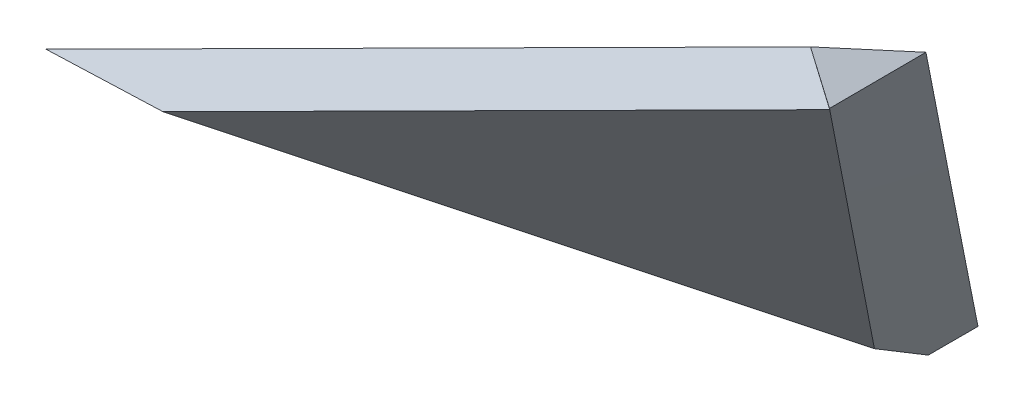
ISO-10303-21;
HEADER;
FILE_DESCRIPTION(('STEP AP214'),'2;1');
FILE_NAME('part.step','',(''),(''),'','','');
FILE_SCHEMA(('AUTOMOTIVE_DESIGN { 1 0 10303 214 1 1 1 1 }'));
ENDSEC;
DATA;
#1=APPLICATION_CONTEXT('core data for automotive mechanical design processes');
#2=APPLICATION_PROTOCOL_DEFINITION('international standard','automotive_design',2000,#1);
#3=PRODUCT_CONTEXT('',#1,'mechanical');
#4=PRODUCT('Part','Part','',(#3));
#5=PRODUCT_RELATED_PRODUCT_CATEGORY('part','',(#4));
#6=PRODUCT_DEFINITION_FORMATION('','',#4);
#7=PRODUCT_DEFINITION_CONTEXT('part definition',#1,'design');
#8=PRODUCT_DEFINITION('design','',#6,#7);
#9=PRODUCT_DEFINITION_SHAPE('','',#8);
#10=(LENGTH_UNIT() NAMED_UNIT(*) SI_UNIT(.MILLI.,.METRE.));
#11=(NAMED_UNIT(*) PLANE_ANGLE_UNIT() SI_UNIT($,.RADIAN.));
#12=(NAMED_UNIT(*) SI_UNIT($,.STERADIAN.) SOLID_ANGLE_UNIT());
#13=UNCERTAINTY_MEASURE_WITH_UNIT(LENGTH_MEASURE(1.E-05),#10,'distance_accuracy_value','');
#14=(GEOMETRIC_REPRESENTATION_CONTEXT(3) GLOBAL_UNCERTAINTY_ASSIGNED_CONTEXT((#13)) GLOBAL_UNIT_ASSIGNED_CONTEXT((#10,
#11,#12)) REPRESENTATION_CONTEXT('',''));
#15=CARTESIAN_POINT('',(0.,0.,0.));
#16=DIRECTION('',(0.,0.,1.));
#17=DIRECTION('',(1.,0.,0.));
#18=AXIS2_PLACEMENT_3D('',#15,#16,#17);
#19=CARTESIAN_POINT('',(255.683748074746,361.646186737307,597.997319736598));
#20=DIRECTION('',(0.,0.748896955513514,-0.662686464342369));
#21=DIRECTION('',(0.,0.662686464342369,0.748896955513514));
#22=AXIS2_PLACEMENT_3D('',#19,#20,#21);
#23=PLANE('',#22);
#24=CARTESIAN_POINT('',(85.6116867373077,31.4461867373069,224.84079999998));
#25=CARTESIAN_POINT('',(86.791715139685,30.5002030900796,223.771751043205));
#26=CARTESIAN_POINT('',(87.971851536975,29.5542786037553,222.702768943719));
#27=CARTESIAN_POINT('',(90.0071896012953,27.9231285745456,220.859418646722));
#28=CARTESIAN_POINT('',(90.8623399626348,27.2378749173705,220.085018677466));
#29=CARTESIAN_POINT('',(92.5727540636482,25.8674297312414,218.536288949587));
#30=CARTESIAN_POINT('',(93.4280178033234,25.1822382022881,217.761959190965));
#31=CARTESIAN_POINT('',(94.2833382255957,24.4970777475199,216.987664549043));
#32=B_SPLINE_CURVE_WITH_KNOTS('',3,(#24,#25,#26,#27,#28,#29,#30,#31),.UNSPECIFIED.,.F.,.F.,(4,2,
2,4),(0.,5.55625411428351,9.58179136847553,13.6073286710568),.UNSPECIFIED.);
#33=CARTESIAN_POINT('',(85.6116867373077,31.4461867373068,224.84079999998));
#34=VERTEX_POINT('',#33);
#35=CARTESIAN_POINT('',(94.2833382407781,24.49707773536,216.987664523408));
#36=VERTEX_POINT('',#35);
#37=EDGE_CURVE('E132',#34,#36,#32,.T.);
#38=ORIENTED_EDGE('',*,*,#37,.T.);
#39=CARTESIAN_POINT('',(133.673368018095,73.6208967689385,272.50212046123));
#40=CARTESIAN_POINT('',(130.389653372821,69.5276720617847,267.876398213436));
#41=CARTESIAN_POINT('',(127.106166331859,65.4343671616797,263.250585340196));
#42=CARTESIAN_POINT('',(120.539754300121,57.2475594550528,253.998735941171));
#43=CARTESIAN_POINT('',(117.256829309338,53.1540566485333,249.372699415391));
#44=CARTESIAN_POINT('',(110.691648134637,44.9668155027644,240.120360190074));
#45=CARTESIAN_POINT('',(107.40939195072,40.8730771635146,235.494057490538));
#46=CARTESIAN_POINT('',(100.845705935215,32.6853095099027,226.241123262694));
#47=CARTESIAN_POINT('',(97.564276103637,28.591280195537,221.614491734383));
#48=CARTESIAN_POINT('',(94.2833382594368,24.4970777204073,216.987664518403));
#49=B_SPLINE_CURVE_WITH_KNOTS('',3,(#39,#40,#41,#42,#43,#44,#45,#46,#47,#48),.UNSPECIFIED.,.F.,
.F.,(4,2,2,2,4),(0.,20.9859760452942,41.9719518319832,62.9579276438979,83.9439037144179),.UNSPECIFIED.);
#50=CARTESIAN_POINT('',(127.002104685391,65.3044903294402,263.103812515501));
#51=VERTEX_POINT('',#50);
#52=EDGE_CURVE('E122',#51,#36,#49,.T.);
#53=ORIENTED_EDGE('',*,*,#52,.F.);
#54=DIRECTION('',(0.323023809091136,0.627160398498758,0.708749217505835));
#55=VECTOR('',#54,1.);
#56=CARTESIAN_POINT('',(113.54960099329,39.1860515676662,233.587562638771));
#57=LINE('',#56,#55);
#58=CARTESIAN_POINT('',(275.298592529249,353.226562308607,588.482365922839));
#59=VERTEX_POINT('',#58);
#60=EDGE_CURVE('E197',#51,#59,#57,.T.);
#61=ORIENTED_EDGE('',*,*,#60,.T.);
#62=DIRECTION('',(-0.839309853134077,0.360271719670673,0.407140342434387));
#63=VECTOR('',#62,1.);
#64=CARTESIAN_POINT('',(355.038501124391,318.998399862187,549.801378716644));
#65=LINE('',#64,#63);
#66=CARTESIAN_POINT('',(255.683748074746,361.646186737307,597.997319736598));
#67=VERTEX_POINT('',#66);
#68=EDGE_CURVE('E195',#59,#67,#65,.T.);
#69=ORIENTED_EDGE('',*,*,#68,.T.);
#70=CARTESIAN_POINT('',(255.683748074746,361.646186737307,597.997319736598));
#71=CARTESIAN_POINT('',(198.993060962267,251.57952007064,473.611813157725));
#72=CARTESIAN_POINT('',(142.302373849787,141.512853403974,349.226306578853));
#73=CARTESIAN_POINT('',(85.6116867373077,31.4461867373069,224.84079999998));
#74=B_SPLINE_CURVE_WITH_KNOTS('',3,(#70,#71,#72,#73),.UNSPECIFIED.,.F.,.F.,(4,4),(0.,1.),.UNSPECIFIED.);
#75=EDGE_CURVE('E57',#34,#67,#74,.F.);
#76=ORIENTED_EDGE('',*,*,#75,.F.);
#77=EDGE_LOOP('',(#38,#53,#61,#69,#76));
#78=FACE_BOUND('',#77,.T.);
#79=ADVANCED_FACE('F41',(#78),#23,.F.);
#80=CARTESIAN_POINT('',(255.683748074746,361.646186737307,597.997319736598));
#81=DIRECTION('',(-0.463959634932353,0.757671489646803,-0.458993868074326));
#82=DIRECTION('',(0.852811638118461,0.522218641844302,0.));
#83=AXIS2_PLACEMENT_3D('',#80,#81,#82);
#84=PLANE('',#83);
#85=CARTESIAN_POINT('',(85.6116867373077,31.4461867373069,224.84079999998));
#86=CARTESIAN_POINT('',(87.0565588673166,30.2878880010275,221.468266328822));
#87=CARTESIAN_POINT('',(88.5018005266442,29.1298559686928,218.095799384672));
#88=CARTESIAN_POINT('',(90.6702176814584,27.3932082761787,213.037199178424));
#89=CARTESIAN_POINT('',(91.3931158628378,26.81439242296,211.351015767494));
#90=CARTESIAN_POINT('',(92.8390971677843,25.6568942252864,207.978682388508));
#91=CARTESIAN_POINT('',(93.5621802913542,25.0782118808334,206.292532420452));
#92=CARTESIAN_POINT('',(94.2853559086845,24.4995963224338,204.606399203203));
#93=B_SPLINE_CURVE_WITH_KNOTS('',3,(#85,#86,#87,#88,#89,#90,#91,#92),.UNSPECIFIED.,.F.,.F.,(4,2,
2,4),(0.,11.5425149767635,17.3137727652761,23.0850306366586),.UNSPECIFIED.);
#94=CARTESIAN_POINT('',(94.285355924013,24.4995963101699,204.606399133237));
#95=VERTEX_POINT('',#94);
#96=EDGE_CURVE('E128',#34,#95,#93,.T.);
#97=ORIENTED_EDGE('',*,*,#96,.F.);
#98=ORIENTED_EDGE('',*,*,#75,.T.);
#99=DIRECTION('',(-0.703292155228626,0.,0.710900938523698));
#100=VECTOR('',#99,1.);
#101=CARTESIAN_POINT('',(350.320400258716,361.646186737307,502.336811715639));
#102=LINE('',#101,#100);
#103=CARTESIAN_POINT('',(350.320400258716,361.646186737307,502.336811715639));
#104=VERTEX_POINT('',#103);
#105=EDGE_CURVE('E11',#104,#67,#102,.T.);
#106=ORIENTED_EDGE('',*,*,#105,.F.);
#107=CARTESIAN_POINT('',(358.920269811262,354.715030365189,482.202486292587));
#108=CARTESIAN_POINT('',(358.196405083762,355.298372315029,483.897118030486));
#109=CARTESIAN_POINT('',(357.47255102983,355.881721957202,485.591751679707));
#110=CARTESIAN_POINT('',(355.662942576478,357.340115293348,489.828340580871));
#111=CARTESIAN_POINT('',(354.577201518018,358.215168602499,492.370298221353));
#112=CARTESIAN_POINT('',(352.405767422695,359.965309834519,497.454222098826));
#113=CARTESIAN_POINT('',(351.320074385833,360.840397757388,499.996188335817));
#114=CARTESIAN_POINT('',(350.234405357301,361.715502986283,502.538158868865));
#115=B_SPLINE_CURVE_WITH_KNOTS('',3,(#107,#108,#109,#110,#111,#112,#113,#114),.UNSPECIFIED.,.F.,
.F.,(4,2,2,4),(0.,5.79865521575473,14.4966380429352,23.1946208738173),.UNSPECIFIED.);
#116=CARTESIAN_POINT('',(358.920269813023,354.715030361971,482.202486275138));
#117=VERTEX_POINT('',#116);
#118=EDGE_CURVE('E103',#117,#104,#115,.T.);
#119=ORIENTED_EDGE('',*,*,#118,.F.);
#120=CARTESIAN_POINT('',(358.92026981327,354.715030361774,482.202486275097));
#121=CARTESIAN_POINT('',(347.891392345303,340.956005258965,470.638351215407));
#122=CARTESIAN_POINT('',(336.862607918635,327.196982025532,459.074125193643));
#123=CARTESIAN_POINT('',(314.80530488357,299.678940859668,435.945413206486));
#124=CARTESIAN_POINT('',(303.776786275174,285.919922927235,424.380927241093));
#125=CARTESIAN_POINT('',(281.720094689012,258.401894021288,401.251617427607));
#126=CARTESIAN_POINT('',(270.691921711246,244.642883047773,389.686793579513));
#127=CARTESIAN_POINT('',(254.150019907439,224.004373818465,372.33920821136));
#128=CARTESIAN_POINT('',(248.636112258375,217.124871957668,366.556621498115));
#129=CARTESIAN_POINT('',(237.608439459981,203.365871104043,354.991308764435));
#130=CARTESIAN_POINT('',(232.094674310651,196.486372111216,349.208582744001));
#131=CARTESIAN_POINT('',(215.553631934114,175.847879682878,331.860156384337));
#132=CARTESIAN_POINT('',(204.526608234026,162.088891366017,320.294208224598));
#133=CARTESIAN_POINT('',(182.473555166235,134.570934893792,297.161340096279));
#134=CARTESIAN_POINT('',(171.447525798529,120.811966738428,285.594420127702));
#135=CARTESIAN_POINT('',(154.909671051817,100.173538546136,268.24287768774));
#136=CARTESIAN_POINT('',(149.397250970578,93.2940664266607,262.458836407628));
#137=CARTESIAN_POINT('',(138.37293270181,79.5351328318868,250.890243878003));
#138=CARTESIAN_POINT('',(132.861034514281,72.6556713565878,245.105692628492));
#139=CARTESIAN_POINT('',(121.837920364888,58.896762257468,233.535923387881));
#140=CARTESIAN_POINT('',(116.326704403032,52.0173146336474,227.750705396774));
#141=CARTESIAN_POINT('',(105.305236604595,38.2584391571064,216.179327495199));
#142=CARTESIAN_POINT('',(99.7949847680189,31.3790113043861,210.393167584724));
#143=CARTESIAN_POINT('',(94.2853559425244,24.4995962953363,204.606399124266));
#144=B_SPLINE_CURVE_WITH_KNOTS('',3,(#120,#121,#122,#123,#124,#125,#126,#127,#128,#129,#130,
#131,#132,#133,#134,#135,#136,#137,#138,#139,#140,#141,#142,#143),.UNSPECIFIED.,.F.,.F.,(4,2,2,
2,2,2,2,2,2,2,2,4),(0.,63.2620357498309,126.524071717887,189.78610768251,221.417125568464,
253.048143487038,316.310181938092,379.572220176311,411.203239867122,442.834259501264,
474.465279543079,506.096299780958),.UNSPECIFIED.);
#145=EDGE_CURVE('E198',#117,#95,#144,.T.);
#146=ORIENTED_EDGE('',*,*,#145,.T.);
#147=EDGE_LOOP('',(#97,#98,#106,#119,#146));
#148=FACE_BOUND('',#147,.T.);
#149=ADVANCED_FACE('F101',(#148),#84,.T.);
#150=CARTESIAN_POINT('',(85.6116867373077,31.4461867373069,230.451572510383));
#151=CARTESIAN_POINT('',(85.6116867373077,31.4461867373069,229.905322987356));
#152=CARTESIAN_POINT('',(85.6116867373077,31.4461867373069,229.359073464329));
#153=CARTESIAN_POINT('',(85.6116867373077,31.4461867373069,228.812823941302));
#154=CARTESIAN_POINT('',(85.6116867373077,31.4461867373069,227.488815960862));
#155=CARTESIAN_POINT('',(85.6116867373077,31.4461867373069,226.164807980421));
#156=CARTESIAN_POINT('',(85.6116867373077,31.4461867373069,224.84079999998));
#157=CARTESIAN_POINT('',(85.6116867373077,31.4461867373069,173.329599999988));
#158=CARTESIAN_POINT('',(85.6116867373077,31.4461867373069,121.818399999995));
#159=CARTESIAN_POINT('',(85.6116867373077,31.4461867373069,70.3072000000032));
#160=CARTESIAN_POINT('',(85.6116867373077,31.4461867373069,69.0582967896457));
#161=CARTESIAN_POINT('',(85.6116867373077,31.4461867373069,67.8093935792882));
#162=CARTESIAN_POINT('',(85.6116867373077,31.4461867373069,66.5604903689307));
#163=CARTESIAN_POINT('',(85.6116867373077,31.4461867373069,66.0196492570227));
#164=CARTESIAN_POINT('',(85.6116867373077,31.4461867373069,65.4788081451148));
#165=CARTESIAN_POINT('',(85.6116867373077,31.4461867373069,64.9379670332069));
#166=CARTESIAN_POINT('',(94.2811443606363,24.4943407304016,230.451572510383));
#167=CARTESIAN_POINT('',(94.2812333684707,24.4944517595647,229.905322987356));
#168=CARTESIAN_POINT('',(94.2813223763052,24.4945627887279,229.359073464329));
#169=CARTESIAN_POINT('',(94.2814113841396,24.494673817891,228.812823941302));
#170=CARTESIAN_POINT('',(94.2816271226953,24.4949429320812,227.488815960862));
#171=CARTESIAN_POINT('',(94.281842861251,24.4952120462714,226.164807980421));
#172=CARTESIAN_POINT('',(94.2820585998066,24.4954811604616,224.84079999998));
#173=CARTESIAN_POINT('',(94.2904520174086,24.5059511841163,173.329599999988));
#174=CARTESIAN_POINT('',(94.2988508466847,24.51646681801,121.818399999995));
#175=CARTESIAN_POINT('',(94.3072548008999,24.5270283852068,70.3072000000032));
#176=CARTESIAN_POINT('',(94.307458557081,24.527284453308,69.0582967896457));
#177=CARTESIAN_POINT('',(94.3076623132622,24.5275405214093,67.8093935792882));
#178=CARTESIAN_POINT('',(94.3078660694433,24.5277965895106,66.5604903689307));
#179=CARTESIAN_POINT('',(94.3079543066411,24.5279074805352,66.0196492570227));
#180=CARTESIAN_POINT('',(94.3080425438389,24.5280183715598,65.4788081451148));
#181=CARTESIAN_POINT('',(94.3081307810367,24.5281292625844,64.9379670332069));
#182=B_SPLINE_SURFACE_WITH_KNOTS('',1,3,((#150,#151,#152,#153,#154,#155,#156,#157,#158,#159,
#160,#161,#162,#163,#164,#165),(#166,#167,#168,#169,#170,#171,#172,#173,#174,#175,#176,#177,
#178,#179,#180,#181)),.UNSPECIFIED.,.F.,.F.,.F.,(2,2),(4,3,3,3,3,4),(0.,1.),
(-0.0363077836173099,-0.0257033029795639,0.,1.,1.0242452750151,1.03474476079504),.UNSPECIFIED.);
#183=CARTESIAN_POINT('',(94.2853559055034,24.4995963250058,204.60639913066));
#184=CARTESIAN_POINT('',(94.2852718310441,24.4994913477687,205.122285188622));
#185=CARTESIAN_POINT('',(94.2851877571238,24.4993863751105,205.638171246586));
#186=CARTESIAN_POINT('',(94.2850196103618,24.4991764389516,206.669943362514));
#187=CARTESIAN_POINT('',(94.2849355375201,24.4990714754508,207.185829420478));
#188=CARTESIAN_POINT('',(94.284767392916,24.4988615576058,208.217601536406));
#189=CARTESIAN_POINT('',(94.2846833211535,24.4987566032617,208.73348759437));
#190=CARTESIAN_POINT('',(94.2845151787083,24.4985467037294,209.765259710297));
#191=CARTESIAN_POINT('',(94.2844311080257,24.4984417585413,210.281145768261));
#192=CARTESIAN_POINT('',(94.2842629677407,24.4982318773205,211.312917884189));
#193=CARTESIAN_POINT('',(94.2841788981384,24.4981269412877,211.828803942153));
#194=CARTESIAN_POINT('',(94.2840107600147,24.497917078377,212.86057605808));
#195=CARTESIAN_POINT('',(94.2839266914933,24.497812151499,213.376462116044));
#196=CARTESIAN_POINT('',(94.2837585555321,24.497602306897,214.408234231972));
#197=CARTESIAN_POINT('',(94.2836744880922,24.4974973891731,214.924120289936));
#198=CARTESIAN_POINT('',(94.2835063542946,24.4972875628786,215.955892405864));
#199=CARTESIAN_POINT('',(94.2834222879368,24.4971826543081,216.471778463828));
#200=CARTESIAN_POINT('',(94.2833382221204,24.497077750314,216.987664521792));
#201=B_SPLINE_CURVE_WITH_KNOTS('',3,(#183,#184,#185,#186,#187,#188,#189,#190,#191,#192,#193,
#194,#195,#196,#197,#198,#199,#200),.UNSPECIFIED.,.F.,.F.,(4,2,2,2,2,2,2,2,4),(0.,
1.54765822648372,3.09531645296129,4.64297467943266,6.19063290589803,7.73829113235725,
9.28594935881036,10.8336075852574,12.3812658116982),.UNSPECIFIED.);
#202=EDGE_CURVE('E239',#95,#36,#201,.T.);
#203=ORIENTED_EDGE('',*,*,#37,.F.);
#204=ORIENTED_EDGE('',*,*,#96,.T.);
#205=ORIENTED_EDGE('',*,*,#202,.T.);
#206=EDGE_LOOP('',(#203,#204,#205));
#207=FACE_BOUND('',#206,.T.);
#208=ADVANCED_FACE('F157',(#207),#182,.F.);
#209=CARTESIAN_POINT('',(357.830221693892,353.226562308607,505.05784284969));
#210=DIRECTION('',(0.550784889286187,0.23217576668005,-0.801704695695699));
#211=DIRECTION('',(0.13147151462021,-0.972673847374612,-0.191365690438326));
#212=AXIS2_PLACEMENT_3D('',#209,#210,#211);
#213=PLANE('',#212);
#214=CARTESIAN_POINT('',(350.320400250583,361.646186743898,502.336811744967));
#215=CARTESIAN_POINT('',(350.683013653656,361.357369155333,502.502287796415));
#216=CARTESIAN_POINT('',(351.045626670622,361.068551082953,502.667763849516));
#217=CARTESIAN_POINT('',(351.770851932341,360.490913970566,502.998715959025));
#218=CARTESIAN_POINT('',(352.133464177094,360.202094930558,503.164192015433));
#219=CARTESIAN_POINT('',(352.858687894384,359.624455882914,503.495144131556));
#220=CARTESIAN_POINT('',(353.221299366922,359.335635875279,503.66062019127));
#221=CARTESIAN_POINT('',(353.946521539784,358.757994892379,503.991572314006));
#222=CARTESIAN_POINT('',(354.309132240109,358.469173917115,504.157048377028));
#223=CARTESIAN_POINT('',(355.034352868542,357.891530998959,504.488000506377));
#224=CARTESIAN_POINT('',(355.396962796652,357.602709056066,504.653476572705));
#225=CARTESIAN_POINT('',(356.122181880658,357.025064202654,504.984428708668));
#226=CARTESIAN_POINT('',(356.484791036554,356.736241292134,505.149904778303));
#227=CARTESIAN_POINT('',(357.210008576131,356.158594503466,505.480856920879));
#228=CARTESIAN_POINT('',(357.572616959813,355.869770625317,505.64633299382));
#229=CARTESIAN_POINT('',(358.297832954962,355.292121901393,505.97728514301));
#230=CARTESIAN_POINT('',(358.660440566429,355.003297055616,506.142761219258));
#231=CARTESIAN_POINT('',(359.02304779178,354.714471726033,506.308237297155));
#232=B_SPLINE_CURVE_WITH_KNOTS('',3,(#214,#215,#216,#217,#218,#219,#220,#221,#222,#223,#224,
#225,#226,#227,#228,#229,#230,#231),.UNSPECIFIED.,.F.,.F.,(4,2,2,2,2,2,2,2,4),(0.,
1.47667790272776,2.95335580546486,4.4300337082206,5.90671161100443,7.38338951382549,
8.86006741669339,10.3367453196173,11.8134232226066),.UNSPECIFIED.);
#233=CARTESIAN_POINT('',(359.023047792249,354.714471726959,506.308237297745));
#234=VERTEX_POINT('',#233);
#235=EDGE_CURVE('E73',#104,#234,#232,.T.);
#236=ORIENTED_EDGE('',*,*,#235,.F.);
#237=CARTESIAN_POINT('',(350.320400244141,361.646186731163,502.336811736854));
#238=DIRECTION('',(0.647082285016741,-0.725475278844528,0.234457109516791));
#239=VECTOR('',#238,1.);
#240=LINE('',#237,#239);
#241=CARTESIAN_POINT('',(357.830221693892,353.226562308607,505.057842849691));
#242=VERTEX_POINT('',#241);
#243=EDGE_CURVE('E108',#104,#242,#240,.T.);
#244=ORIENTED_EDGE('',*,*,#243,.T.);
#245=CARTESIAN_POINT('',(359.023047791972,354.714471726611,506.30823729806));
#246=CARTESIAN_POINT('',(358.973346664366,354.652475438796,506.256138953215));
#247=CARTESIAN_POINT('',(358.923645588026,354.590479216408,506.204040481607));
#248=CARTESIAN_POINT('',(358.824243431592,354.466486769926,506.099843168876));
#249=CARTESIAN_POINT('',(358.774542351497,354.404490545833,506.047744327753));
#250=CARTESIAN_POINT('',(358.675140189012,354.280498097787,505.943546272949));
#251=CARTESIAN_POINT('',(358.625439106621,354.218501873834,505.891447059267));
#252=CARTESIAN_POINT('',(358.526036938173,354.094509424332,505.787248262865));
#253=CARTESIAN_POINT('',(358.476335852116,354.032513198782,505.735148680144));
#254=CARTESIAN_POINT('',(358.376933677131,353.908520747099,505.630949142904));
#255=CARTESIAN_POINT('',(358.327232588204,353.846524520967,505.578849188384));
#256=CARTESIAN_POINT('',(358.22783040733,353.722532067918,505.474648909883));
#257=CARTESIAN_POINT('',(358.178129315383,353.660535841001,505.4225485859));
#258=CARTESIAN_POINT('',(358.078727128313,353.536543386204,505.318347565846));
#259=CARTESIAN_POINT('',(358.02902603319,353.474547158323,505.266246869774));
#260=CARTESIAN_POINT('',(357.929623839339,353.350554701042,505.162045108269));
#261=CARTESIAN_POINT('',(357.879922740611,353.288558471643,505.109944042835));
#262=CARTESIAN_POINT('',(357.830221693349,353.226562307924,505.057842850152));
#263=B_SPLINE_CURVE_WITH_KNOTS('',3,(#245,#246,#247,#248,#249,#250,#251,#252,#253,#254,#255,
#256,#257,#258,#259,#260,#261,#262),.UNSPECIFIED.,.F.,.F.,(4,2,2,2,2,2,2,2,4),(0.,
0.285047038071579,0.570094693202648,0.855142964505326,1.1401918517452,1.42524135622596,
1.71029147473999,1.99534221220848,2.28039356590474),.UNSPECIFIED.);
#264=EDGE_CURVE('E116',#242,#234,#263,.F.);
#265=ORIENTED_EDGE('',*,*,#264,.T.);
#266=EDGE_LOOP('',(#236,#244,#265));
#267=FACE_BOUND('',#266,.T.);
#268=ADVANCED_FACE('F120',(#267),#213,.F.);
#269=CARTESIAN_POINT('',(187.540158934645,55.3828377515093,185.532913830396));
#270=DIRECTION('',(0.463959634932353,-0.757671489646803,0.458993868074326));
#271=DIRECTION('',(-0.852811638118461,-0.522218641844302,0.));
#272=AXIS2_PLACEMENT_3D('',#269,#270,#271);
#273=PLANE('',#272);
#274=ORIENTED_EDGE('',*,*,#60,.F.);
#275=CARTESIAN_POINT('',(465.658232229656,487.729864730068,618.09088471165));
#276=CARTESIAN_POINT('',(445.646109232041,462.766907206964,597.112600246277));
#277=CARTESIAN_POINT('',(425.633960073746,437.803949159988,576.134341359843));
#278=CARTESIAN_POINT('',(385.609564818301,387.878031451224,534.177918908988));
#279=CARTESIAN_POINT('',(365.597318721152,362.915071789436,513.199755344566));
#280=CARTESIAN_POINT('',(325.572684434146,312.989149614933,471.243567139613));
#281=CARTESIAN_POINT('',(305.560296244289,288.026187102217,450.265542499081));
#282=CARTESIAN_POINT('',(275.541534030604,250.581739585817,418.798681228004));
#283=CARTESIAN_POINT('',(265.535249911287,238.100256381032,408.30975668977));
#284=CARTESIAN_POINT('',(245.522600766479,213.137288329047,387.331986683615));
#285=CARTESIAN_POINT('',(235.516235740988,200.655803481847,376.843141215694));
#286=CARTESIAN_POINT('',(218.838867753819,179.853326760873,359.361822791491));
#287=CARTESIAN_POINT('',(212.167895741945,171.532335506033,352.369319572255));
#288=CARTESIAN_POINT('',(198.825888884198,154.890351756533,338.38437460097));
#289=CARTESIAN_POINT('',(192.154854038325,146.569359261873,331.391932848922));
#290=CARTESIAN_POINT('',(178.812703512365,129.927372718055,317.407128487527));
#291=CARTESIAN_POINT('',(172.141587832278,121.606378668899,310.414765878181));
#292=CARTESIAN_POINT('',(158.799250134165,104.964388796082,296.430145218665));
#293=CARTESIAN_POINT('',(152.128028116143,96.6433929724215,289.437887168491));
#294=CARTESIAN_POINT('',(138.785439355223,80.001398377157,275.453512492531));
#295=CARTESIAN_POINT('',(132.114072612325,71.6803996055527,268.461395866746));
#296=CARTESIAN_POINT('',(118.771136533323,55.0383978005973,254.477360365238));
#297=CARTESIAN_POINT('',(112.099567197214,46.7173947672461,247.485441489521));
#298=CARTESIAN_POINT('',(100.42405872398,32.1556327904236,235.249837420273));
#299=CARTESIAN_POINT('',(95.4201848260544,25.9148751467369,230.006088427317));
#300=CARTESIAN_POINT('',(85.4122046575525,13.4333552691504,219.518817750883));
#301=CARTESIAN_POINT('',(80.4080983869773,7.19259303525058,214.275296067404));
#302=CARTESIAN_POINT('',(70.3995519490581,-5.28893781751629,203.788579669771));
#303=CARTESIAN_POINT('',(65.3951117817276,-11.529706436383,198.545384955604));
#304=CARTESIAN_POINT('',(55.3857315995014,-24.0112531419172,188.059485153879));
#305=CARTESIAN_POINT('',(50.3807915846414,-30.2520312285839,182.816780066287));
#306=CARTESIAN_POINT('',(42.8727689203201,-39.6132112357441,174.953320448369));
#307=CARTESIAN_POINT('',(40.3699922676215,-42.7336071218788,172.332266571811));
#308=CARTESIAN_POINT('',(35.3641675819985,-48.9744041938711,167.090424386562));
#309=CARTESIAN_POINT('',(32.8611195490773,-52.0948053797286,164.469636077867));
#310=CARTESIAN_POINT('',(27.8546584626832,-58.335614846985,159.228416717346));
#311=CARTESIAN_POINT('',(25.3512454092164,-61.4560231283838,156.607985665514));
#312=CARTESIAN_POINT('',(20.3439109306267,-67.6968497247346,151.367620870871));
#313=CARTESIAN_POINT('',(17.8399895054819,-70.8172680396871,148.74768712808));
#314=CARTESIAN_POINT('',(12.8314069453816,-77.0581192079627,143.508543356274));
#315=CARTESIAN_POINT('',(10.3267458103638,-80.178552061287,140.88933332732));
#316=CARTESIAN_POINT('',(5.31630203750007,-86.4194388497221,135.652012105385));
#317=CARTESIAN_POINT('',(2.81051939978658,-89.5398927848304,133.033900912275));
#318=CARTESIAN_POINT('',(-0.949555466504763,-94.2206013784216,129.108104478466));
#319=CARTESIAN_POINT('',(-2.20314786514289,-95.7808429687994,127.799733408317));
#320=CARTESIAN_POINT('',(-4.7109618090256,-98.9013376265991,125.183608275827));
#321=CARTESIAN_POINT('',(-5.96518335423222,-100.46159069402,123.87585421345));
#322=CARTESIAN_POINT('',(-8.47448331984522,-103.582112906489,121.261185694564));
#323=CARTESIAN_POINT('',(-9.7295617405938,-105.142382051543,119.954271238392));
#324=CARTESIAN_POINT('',(-11.6130944270225,-107.482801882817,117.994797910012));
#325=CARTESIAN_POINT('',(-12.2410912287207,-108.26294459123,117.341789793752));
#326=CARTESIAN_POINT('',(-13.4974604727769,-109.823236460905,116.036142614014));
#327=CARTESIAN_POINT('',(-14.125832915158,-110.603385622168,115.383503550559));
#328=CARTESIAN_POINT('',(-14.7544284713953,-111.383538528876,114.731083832094));
#329=B_SPLINE_CURVE_WITH_KNOTS('',3,(#275,#276,#277,#278,#279,#280,#281,#282,#283,#284,#285,
#286,#287,#288,#289,#290,#291,#292,#293,#294,#295,#296,#297,#298,#299,#300,#301,#302,#303,#304,
#305,#306,#307,#308,#309,#310,#311,#312,#313,#314,#315,#316,#317,#318,#319,#320,#321,#322,#323,
#324,#325,#326,#327,#328),.UNSPECIFIED.,.F.,.F.,(4,2,2,2,2,2,2,2,2,2,2,2,2,2,2,2,2,2,2,2,2,2,2,
2,2,2,4),(0.,114.775888620312,229.551775718308,344.327662847869,401.715607100161,
459.103551464103,497.362181586454,535.620811632131,573.879441392566,612.138069518393,
650.396697917815,688.655327345433,717.349306171823,746.043284839191,774.737262354492,
803.431237818933,817.778229268213,832.125220548162,846.472211589341,860.819203247916,
875.166196115406,889.51318729029,896.686690025781,903.860192328331,911.033697497315,
914.620450808582,918.207204341139),.UNSPECIFIED.);
#330=EDGE_CURVE('E65',#51,#242,#329,.F.);
#331=ORIENTED_EDGE('',*,*,#330,.T.);
#332=DIRECTION('',(-0.703292155228626,0.,0.710900938523698));
#333=VECTOR('',#332,1.);
#334=CARTESIAN_POINT('',(355.476151701902,353.226562308607,507.437381074615));
#335=LINE('',#334,#333);
#336=EDGE_CURVE('E111',#242,#59,#335,.T.);
#337=ORIENTED_EDGE('',*,*,#336,.T.);
#338=EDGE_LOOP('',(#274,#331,#337));
#339=FACE_BOUND('',#338,.T.);
#340=ADVANCED_FACE('F211',(#339),#273,.T.);
#341=CARTESIAN_POINT('',(350.320400258716,361.646186737307,502.336811715639));
#342=DIRECTION('',(0.538629373082561,0.652636126625238,0.532864414908984));
#343=DIRECTION('',(-0.703292155228626,0.,0.710900938523698));
#344=AXIS2_PLACEMENT_3D('',#341,#342,#343);
#345=PLANE('',#344);
#346=ORIENTED_EDGE('',*,*,#68,.F.);
#347=ORIENTED_EDGE('',*,*,#336,.F.);
#348=ORIENTED_EDGE('',*,*,#243,.F.);
#349=ORIENTED_EDGE('',*,*,#105,.T.);
#350=EDGE_LOOP('',(#346,#347,#348,#349));
#351=FACE_BOUND('',#350,.T.);
#352=ADVANCED_FACE('F110',(#351),#345,.T.);
#353=CARTESIAN_POINT('',(350.253195264404,361.715504021864,506.925963753832));
#354=CARTESIAN_POINT('',(350.246645074935,361.715503667409,505.396370383162));
#355=CARTESIAN_POINT('',(350.240094885465,361.715503312954,503.866777012492));
#356=CARTESIAN_POINT('',(350.233544695996,361.715502958499,502.337183641822));
#357=CARTESIAN_POINT('',(349.578525749051,361.715467513005,349.377846574822));
#358=CARTESIAN_POINT('',(348.923506796167,361.715432015562,196.418509507847));
#359=CARTESIAN_POINT('',(348.268487837452,361.715396466049,43.4591724408974));
#360=CARTESIAN_POINT('',(348.261937647864,361.715396110553,41.9295790702279));
#361=CARTESIAN_POINT('',(348.255387458277,361.715395755058,40.3999856995584));
#362=CARTESIAN_POINT('',(348.24883726869,361.715395399563,38.8703923288889));
#363=CARTESIAN_POINT('',(350.340049978508,361.646186737307,506.925591831283));
#364=CARTESIAN_POINT('',(350.333500071911,361.646186737307,505.395998459402));
#365=CARTESIAN_POINT('',(350.326950165314,361.646186737307,503.866405087521));
#366=CARTESIAN_POINT('',(350.320400258716,361.646186737307,502.336811715639));
#367=CARTESIAN_POINT('',(349.665409598995,361.646186737307,349.37747452751));
#368=CARTESIAN_POINT('',(349.010418939275,361.646186737307,196.418137339381));
#369=CARTESIAN_POINT('',(348.355428279554,361.646186737307,43.4588001512512));
#370=CARTESIAN_POINT('',(348.348878372957,361.646186737307,41.9292067793699));
#371=CARTESIAN_POINT('',(348.342328466359,361.646186737307,40.3996134074886));
#372=CARTESIAN_POINT('',(348.335778559762,361.646186737307,38.8700200356073));
#373=CARTESIAN_POINT('',(359.025521388904,354.714458281584,506.888399576442));
#374=CARTESIAN_POINT('',(359.01899976953,354.714493727079,505.358806083431));
#375=CARTESIAN_POINT('',(359.012478150157,354.714529172574,503.829212590421));
#376=CARTESIAN_POINT('',(359.005956530783,354.714564618068,502.29961909741));
#377=CARTESIAN_POINT('',(358.353794593399,354.718109167544,349.340269796345));
#378=CARTESIAN_POINT('',(357.701633250067,354.72165891179,196.380920492734));
#379=CARTESIAN_POINT('',(357.049472489765,354.725213863131,43.4215711866285));
#380=CARTESIAN_POINT('',(357.042950882162,354.725249412644,41.8919776935674));
#381=CARTESIAN_POINT('',(357.036429274559,354.725284962158,40.3623842005063));
#382=CARTESIAN_POINT('',(357.029907666956,354.725320511671,38.8327907074453));
#383=B_SPLINE_SURFACE_WITH_KNOTS('',1,3,((#353,#354,#355,#356,#357,#358,#359,#360,#361,#362),
(#363,#364,#365,#366,#367,#368,#369,#370,#371,#372),(#373,#374,#375,#376,#377,#378,#379,#380,
#381,#382)),.UNSPECIFIED.,.F.,.F.,.F.,(2,1,2),(4,3,3,4),(-0.01,0.,1.),(-0.01,0.,1.,1.01),.UNSPECIFIED.);
#384=CARTESIAN_POINT('',(359.025521388408,354.714458281981,506.888399576444));
#385=CARTESIAN_POINT('',(359.018999769034,354.714493727475,505.358806083433));
#386=CARTESIAN_POINT('',(359.01247814966,354.71452917297,503.829212590423));
#387=CARTESIAN_POINT('',(359.005956530286,354.714564618465,502.299619097412));
#388=CARTESIAN_POINT('',(358.353794592902,354.71810916794,349.340269796347));
#389=CARTESIAN_POINT('',(357.70163324957,354.721658912186,196.380920492736));
#390=CARTESIAN_POINT('',(357.049472489268,354.725213863527,43.4215711866306));
#391=CARTESIAN_POINT('',(357.042950881665,354.72524941304,41.8919776935695));
#392=CARTESIAN_POINT('',(357.036429274062,354.725284962554,40.3623842005085));
#393=CARTESIAN_POINT('',(357.029907666459,354.725320512067,38.8327907074474));
#394=B_SPLINE_CURVE_WITH_KNOTS('',3,(#384,#385,#386,#387,#388,#389,#390,#391,#392,#393),
.UNSPECIFIED.,.F.,.F.,(4,3,3,4),(-0.01,0.,1.,1.01),.UNSPECIFIED.);
#395=EDGE_CURVE('E126',#234,#117,#394,.T.);
#396=ORIENTED_EDGE('',*,*,#395,.T.);
#397=ORIENTED_EDGE('',*,*,#118,.T.);
#398=ORIENTED_EDGE('',*,*,#235,.T.);
#399=EDGE_LOOP('',(#396,#397,#398));
#400=FACE_BOUND('',#399,.T.);
#401=ADVANCED_FACE('F125',(#400),#383,.T.);
#402=CARTESIAN_POINT('',(85.6116867373077,31.4461867373069,233.752678933035));
#403=CARTESIAN_POINT('',(85.6116867373077,31.4461867373069,231.302315742016));
#404=CARTESIAN_POINT('',(85.6116867373077,31.4461867373069,228.851952550998));
#405=CARTESIAN_POINT('',(85.6116867373077,31.4461867373069,225.88132623998));
#406=CARTESIAN_POINT('',(85.6116867373077,31.4461867373069,225.36106311998));
#407=CARTESIAN_POINT('',(85.6116867373077,31.4461867373069,173.329599999988));
#408=CARTESIAN_POINT('',(85.6116867373077,31.4461867373069,121.818399999995));
#409=CARTESIAN_POINT('',(85.6116867373077,31.4461867373069,69.7920880000032));
#410=CARTESIAN_POINT('',(85.6116867373077,31.4461867373069,69.2769760000033));
#411=CARTESIAN_POINT('',(85.6116867373077,31.4461867373069,68.0280727896519));
#412=CARTESIAN_POINT('',(85.6116867373077,31.4461867373069,67.2942815793003));
#413=CARTESIAN_POINT('',(85.6116867373077,31.4461867373069,66.5604903689488));
#414=CARTESIAN_POINT('',(173.885697576411,141.512853403974,332.101815142198));
#415=CARTESIAN_POINT('',(173.875311712088,141.512853403974,328.042838800621));
#416=CARTESIAN_POINT('',(173.864925847764,141.512853403974,323.983862459044));
#417=CARTESIAN_POINT('',(173.852334848219,141.512853403974,319.0630809356));
#418=CARTESIAN_POINT('',(173.850129712998,141.512853403974,318.201275753733));
#419=CARTESIAN_POINT('',(173.62959435787,141.512853403974,232.012224842495));
#420=CARTESIAN_POINT('',(173.411264137963,141.512853403974,146.684979113124));
#421=CARTESIAN_POINT('',(173.190750615857,141.512853403974,60.5044609264588));
#422=CARTESIAN_POINT('',(173.188567313658,141.512853403974,59.6511884691651));
#423=CARTESIAN_POINT('',(173.183273837433,141.512853403974,57.5824059301857));
#424=CARTESIAN_POINT('',(173.180163663406,141.512853403974,56.3668958485001));
#425=CARTESIAN_POINT('',(173.177053489379,141.512853403974,55.1513857668144));
#426=CARTESIAN_POINT('',(262.159708415515,251.57952007064,430.450951351362));
#427=CARTESIAN_POINT('',(262.138936686868,251.57952007064,424.783361859226));
#428=CARTESIAN_POINT('',(262.11816495822,251.57952007064,419.115772367089));
#429=CARTESIAN_POINT('',(262.092982959131,251.57952007064,412.24483563122));
#430=CARTESIAN_POINT('',(262.088572688689,251.57952007064,411.041488387486));
#431=CARTESIAN_POINT('',(261.647501978433,251.57952007064,290.694849685003));
#432=CARTESIAN_POINT('',(261.210841538619,251.57952007064,171.551558226252));
#433=CARTESIAN_POINT('',(260.769814494407,251.57952007064,51.2168338529143));
#434=CARTESIAN_POINT('',(260.765447890009,251.57952007064,50.0254009383268));
#435=CARTESIAN_POINT('',(260.754860937557,251.57952007064,47.1367390707195));
#436=CARTESIAN_POINT('',(260.748640589504,251.57952007064,45.4395101176997));
#437=CARTESIAN_POINT('',(260.742420241451,251.57952007064,43.7422811646799));
#438=CARTESIAN_POINT('',(350.433719254618,361.646186737307,528.800087560526));
#439=CARTESIAN_POINT('',(350.402561661647,361.646186737307,521.523884917831));
#440=CARTESIAN_POINT('',(350.371404068677,361.646186737307,514.247682275135));
#441=CARTESIAN_POINT('',(350.333631070043,361.646186737307,505.42659032684));
#442=CARTESIAN_POINT('',(350.32701566438,361.646186737307,503.88170102124));
#443=CARTESIAN_POINT('',(349.665409598995,361.646186737307,349.37747452751));
#444=CARTESIAN_POINT('',(349.010418939275,361.646186737307,196.418137339381));
#445=CARTESIAN_POINT('',(348.348878372957,361.646186737307,41.9292067793699));
#446=CARTESIAN_POINT('',(348.342328466359,361.646186737307,40.3996134074886));
#447=CARTESIAN_POINT('',(348.326448037682,361.646186737307,36.6910722112533));
#448=CARTESIAN_POINT('',(348.317117515602,361.646186737307,34.5121243868994));
#449=CARTESIAN_POINT('',(348.307786993522,361.646186737307,32.3331765625454));
#450=B_SPLINE_SURFACE_WITH_KNOTS('',3,3,((#402,#403,#404,#405,#406,#407,#408,#409,#410,#411,
#412,#413),(#414,#415,#416,#417,#418,#419,#420,#421,#422,#423,#424,#425),(#426,#427,#428,#429,
#430,#431,#432,#433,#434,#435,#436,#437),(#438,#439,#440,#441,#442,#443,#444,#445,#446,#447,
#448,#449)),.UNSPECIFIED.,.F.,.F.,.F.,(4,4),(4,2,2,2,2,4),(0.,1.),(-0.0576695225702109,-0.0101,
0.,1.,1.01,1.02424527501498),.UNSPECIFIED.);
#451=OFFSET_SURFACE('',#450,-11.1125,.F.);
#452=ORIENTED_EDGE('',*,*,#145,.F.);
#453=ORIENTED_EDGE('',*,*,#395,.F.);
#454=ORIENTED_EDGE('',*,*,#264,.F.);
#455=ORIENTED_EDGE('',*,*,#330,.F.);
#456=ORIENTED_EDGE('',*,*,#52,.T.);
#457=ORIENTED_EDGE('',*,*,#202,.F.);
#458=EDGE_LOOP('',(#452,#453,#454,#455,#456,#457));
#459=FACE_BOUND('',#458,.T.);
#460=ADVANCED_FACE('F158',(#459),#451,.F.);
#461=CLOSED_SHELL('',(#79,#149,#208,#268,#340,#352,#401,#460));
#462=MANIFOLD_SOLID_BREP('B2',#461);
#463=ADVANCED_BREP_SHAPE_REPRESENTATION('',(#18,#462),#14);
#464=SHAPE_DEFINITION_REPRESENTATION(#9,#463);
ENDSEC;
END-ISO-10303-21;
